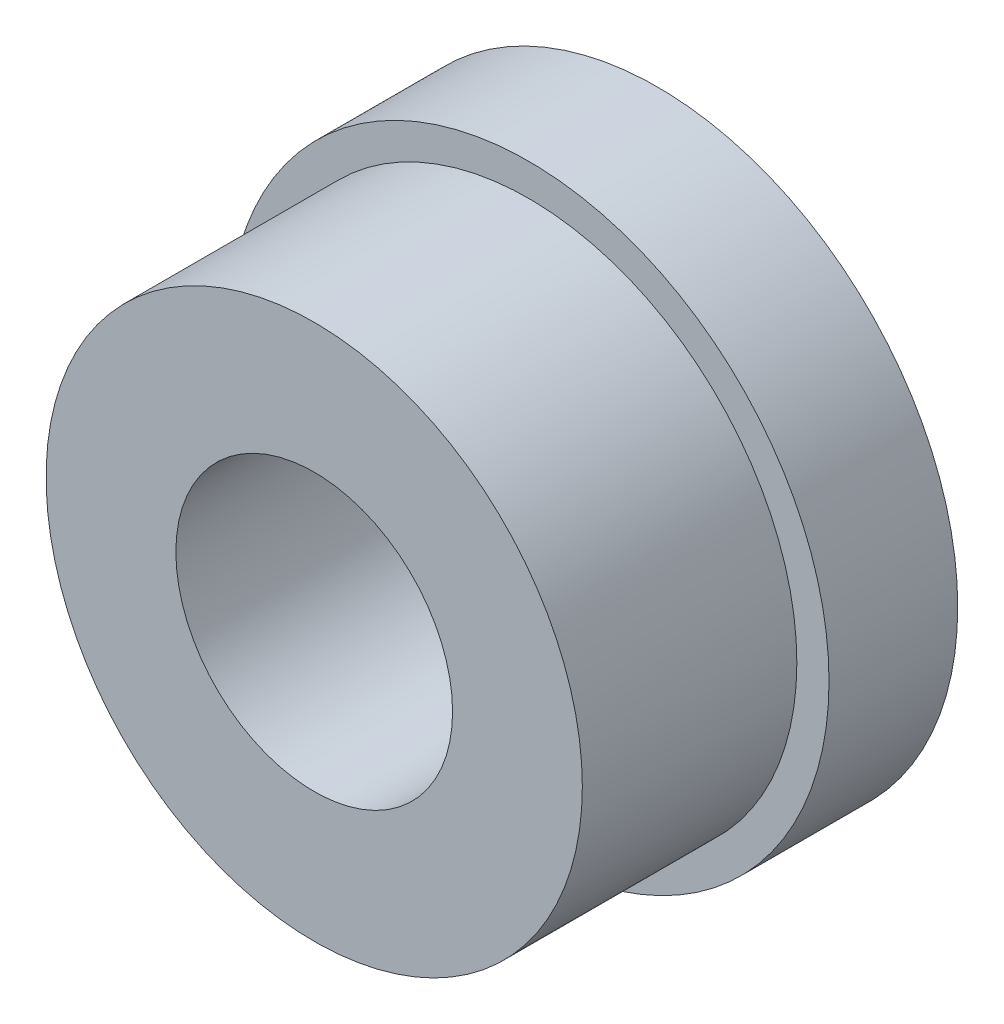
ISO-10303-21;
HEADER;
FILE_DESCRIPTION(('STEP AP214'),'2;1');
FILE_NAME('part.step','',(''),(''),'','','');
FILE_SCHEMA(('AUTOMOTIVE_DESIGN { 1 0 10303 214 1 1 1 1 }'));
ENDSEC;
DATA;
#1=APPLICATION_CONTEXT('core data for automotive mechanical design processes');
#2=APPLICATION_PROTOCOL_DEFINITION('international standard','automotive_design',2000,#1);
#3=PRODUCT_CONTEXT('',#1,'mechanical');
#4=PRODUCT('Part','Part','',(#3));
#5=PRODUCT_RELATED_PRODUCT_CATEGORY('part','',(#4));
#6=PRODUCT_DEFINITION_FORMATION('','',#4);
#7=PRODUCT_DEFINITION_CONTEXT('part definition',#1,'design');
#8=PRODUCT_DEFINITION('design','',#6,#7);
#9=PRODUCT_DEFINITION_SHAPE('','',#8);
#10=(LENGTH_UNIT() NAMED_UNIT(*) SI_UNIT(.MILLI.,.METRE.));
#11=(NAMED_UNIT(*) PLANE_ANGLE_UNIT() SI_UNIT($,.RADIAN.));
#12=(NAMED_UNIT(*) SI_UNIT($,.STERADIAN.) SOLID_ANGLE_UNIT());
#13=UNCERTAINTY_MEASURE_WITH_UNIT(LENGTH_MEASURE(1.E-05),#10,'distance_accuracy_value','');
#14=(GEOMETRIC_REPRESENTATION_CONTEXT(3) GLOBAL_UNCERTAINTY_ASSIGNED_CONTEXT((#13)) GLOBAL_UNIT_ASSIGNED_CONTEXT((#10,
#11,#12)) REPRESENTATION_CONTEXT('',''));
#15=CARTESIAN_POINT('',(0.,0.,0.));
#16=DIRECTION('',(0.,0.,1.));
#17=DIRECTION('',(1.,0.,0.));
#18=AXIS2_PLACEMENT_3D('',#15,#16,#17);
#19=CARTESIAN_POINT('',(0.,0.,10.));
#20=DIRECTION('',(0.,0.,1.));
#21=DIRECTION('',(1.,0.,0.));
#22=AXIS2_PLACEMENT_3D('',#19,#20,#21);
#23=PLANE('',#22);
#24=CARTESIAN_POINT('',(0.,0.,10.));
#25=DIRECTION('',(0.,0.,1.));
#26=DIRECTION('',(1.,0.,0.));
#27=AXIS2_PLACEMENT_3D('',#24,#25,#26);
#28=CIRCLE('',#27,12.5);
#29=CARTESIAN_POINT('',(12.5,0.,10.));
#30=VERTEX_POINT('',#29);
#31=EDGE_CURVE('E10',#30,#30,#28,.T.);
#32=ORIENTED_EDGE('',*,*,#31,.T.);
#33=EDGE_LOOP('',(#32));
#34=FACE_BOUND('',#33,.T.);
#35=CARTESIAN_POINT('',(0.,0.,10.));
#36=DIRECTION('',(0.,0.,1.));
#37=DIRECTION('',(1.,0.,0.));
#38=AXIS2_PLACEMENT_3D('',#35,#36,#37);
#39=CIRCLE('',#38,6.45);
#40=CARTESIAN_POINT('',(6.45,0.,10.));
#41=VERTEX_POINT('',#40);
#42=EDGE_CURVE('E50',#41,#41,#39,.T.);
#43=ORIENTED_EDGE('',*,*,#42,.F.);
#44=EDGE_LOOP('',(#43));
#45=FACE_BOUND('',#44,.T.);
#46=ADVANCED_FACE('F41',(#34,#45),#23,.T.);
#47=CARTESIAN_POINT('',(0.,0.,10.));
#48=DIRECTION('',(0.,0.,-1.));
#49=DIRECTION('',(-1.,0.,0.));
#50=AXIS2_PLACEMENT_3D('',#47,#48,#49);
#51=CYLINDRICAL_SURFACE('',#50,12.5);
#52=ORIENTED_EDGE('',*,*,#31,.F.);
#53=EDGE_LOOP('',(#52));
#54=FACE_BOUND('',#53,.T.);
#55=CARTESIAN_POINT('',(0.,0.,0.));
#56=DIRECTION('',(0.,0.,1.));
#57=DIRECTION('',(1.,0.,0.));
#58=AXIS2_PLACEMENT_3D('',#55,#56,#57);
#59=CIRCLE('',#58,12.5);
#60=CARTESIAN_POINT('',(12.5,0.,0.));
#61=VERTEX_POINT('',#60);
#62=EDGE_CURVE('E45',#61,#61,#59,.T.);
#63=ORIENTED_EDGE('',*,*,#62,.T.);
#64=EDGE_LOOP('',(#63));
#65=FACE_BOUND('',#64,.T.);
#66=ADVANCED_FACE('F43',(#54,#65),#51,.T.);
#67=CARTESIAN_POINT('',(0.,0.,10.));
#68=DIRECTION('',(0.,0.,-1.));
#69=DIRECTION('',(-1.,0.,0.));
#70=AXIS2_PLACEMENT_3D('',#67,#68,#69);
#71=CYLINDRICAL_SURFACE('',#70,6.45);
#72=ORIENTED_EDGE('',*,*,#42,.T.);
#73=EDGE_LOOP('',(#72));
#74=FACE_BOUND('',#73,.T.);
#75=CARTESIAN_POINT('',(0.,0.,-6.));
#76=DIRECTION('',(0.,0.,-1.));
#77=DIRECTION('',(-1.,0.,0.));
#78=AXIS2_PLACEMENT_3D('',#75,#76,#77);
#79=CIRCLE('',#78,6.45);
#80=CARTESIAN_POINT('',(-6.45,0.,-6.));
#81=VERTEX_POINT('',#80);
#82=EDGE_CURVE('E62',#81,#81,#79,.T.);
#83=ORIENTED_EDGE('',*,*,#82,.T.);
#84=EDGE_LOOP('',(#83));
#85=FACE_BOUND('',#84,.T.);
#86=ADVANCED_FACE('F70',(#74,#85),#71,.F.);
#87=CARTESIAN_POINT('',(0.,0.,-6.));
#88=DIRECTION('',(0.,0.,-1.));
#89=DIRECTION('',(-1.,0.,0.));
#90=AXIS2_PLACEMENT_3D('',#87,#88,#89);
#91=PLANE('',#90);
#92=CARTESIAN_POINT('',(0.,0.,-6.));
#93=DIRECTION('',(0.,0.,-1.));
#94=DIRECTION('',(-1.,0.,0.));
#95=AXIS2_PLACEMENT_3D('',#92,#93,#94);
#96=CIRCLE('',#95,14.);
#97=CARTESIAN_POINT('',(-14.,0.,-6.));
#98=VERTEX_POINT('',#97);
#99=EDGE_CURVE('E61',#98,#98,#96,.T.);
#100=ORIENTED_EDGE('',*,*,#99,.T.);
#101=EDGE_LOOP('',(#100));
#102=FACE_BOUND('',#101,.T.);
#103=ORIENTED_EDGE('',*,*,#82,.F.);
#104=EDGE_LOOP('',(#103));
#105=FACE_BOUND('',#104,.T.);
#106=ADVANCED_FACE('F72',(#102,#105),#91,.T.);
#107=CARTESIAN_POINT('',(0.,0.,0.));
#108=DIRECTION('',(0.,0.,-1.));
#109=DIRECTION('',(-1.,0.,0.));
#110=AXIS2_PLACEMENT_3D('',#107,#108,#109);
#111=PLANE('',#110);
#112=ORIENTED_EDGE('',*,*,#62,.F.);
#113=EDGE_LOOP('',(#112));
#114=FACE_BOUND('',#113,.T.);
#115=CARTESIAN_POINT('',(0.,0.,0.));
#116=DIRECTION('',(0.,0.,-1.));
#117=DIRECTION('',(-1.,0.,0.));
#118=AXIS2_PLACEMENT_3D('',#115,#116,#117);
#119=CIRCLE('',#118,14.);
#120=CARTESIAN_POINT('',(-14.,0.,0.));
#121=VERTEX_POINT('',#120);
#122=EDGE_CURVE('E57',#121,#121,#119,.T.);
#123=ORIENTED_EDGE('',*,*,#122,.F.);
#124=EDGE_LOOP('',(#123));
#125=FACE_BOUND('',#124,.T.);
#126=ADVANCED_FACE('F74',(#114,#125),#111,.F.);
#127=CARTESIAN_POINT('',(0.,0.,-6.));
#128=DIRECTION('',(0.,0.,1.));
#129=DIRECTION('',(1.,0.,0.));
#130=AXIS2_PLACEMENT_3D('',#127,#128,#129);
#131=CYLINDRICAL_SURFACE('',#130,14.);
#132=ORIENTED_EDGE('',*,*,#99,.F.);
#133=EDGE_LOOP('',(#132));
#134=FACE_BOUND('',#133,.T.);
#135=ORIENTED_EDGE('',*,*,#122,.T.);
#136=EDGE_LOOP('',(#135));
#137=FACE_BOUND('',#136,.T.);
#138=ADVANCED_FACE('F81',(#134,#137),#131,.T.);
#139=CLOSED_SHELL('',(#46,#66,#86,#106,#126,#138));
#140=MANIFOLD_SOLID_BREP('B2',#139);
#141=ADVANCED_BREP_SHAPE_REPRESENTATION('',(#18,#140),#14);
#142=SHAPE_DEFINITION_REPRESENTATION(#9,#141);
ENDSEC;
END-ISO-10303-21;
